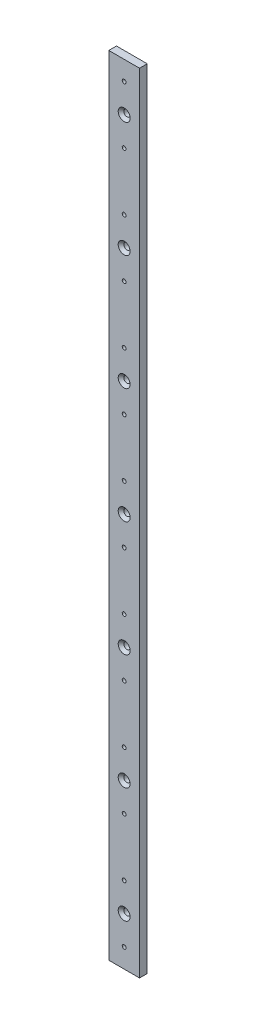
ISO-10303-21;
HEADER;
FILE_DESCRIPTION(('STEP AP214'),'2;1');
FILE_NAME('part.step','',(''),(''),'','','');
FILE_SCHEMA(('AUTOMOTIVE_DESIGN { 1 0 10303 214 1 1 1 1 }'));
ENDSEC;
DATA;
#1=APPLICATION_CONTEXT('core data for automotive mechanical design processes');
#2=APPLICATION_PROTOCOL_DEFINITION('international standard','automotive_design',2000,#1);
#3=PRODUCT_CONTEXT('',#1,'mechanical');
#4=PRODUCT('Part','Part','',(#3));
#5=PRODUCT_RELATED_PRODUCT_CATEGORY('part','',(#4));
#6=PRODUCT_DEFINITION_FORMATION('','',#4);
#7=PRODUCT_DEFINITION_CONTEXT('part definition',#1,'design');
#8=PRODUCT_DEFINITION('design','',#6,#7);
#9=PRODUCT_DEFINITION_SHAPE('','',#8);
#10=(LENGTH_UNIT() NAMED_UNIT(*) SI_UNIT(.MILLI.,.METRE.));
#11=(NAMED_UNIT(*) PLANE_ANGLE_UNIT() SI_UNIT($,.RADIAN.));
#12=(NAMED_UNIT(*) SI_UNIT($,.STERADIAN.) SOLID_ANGLE_UNIT());
#13=UNCERTAINTY_MEASURE_WITH_UNIT(LENGTH_MEASURE(1.E-05),#10,'distance_accuracy_value','');
#14=(GEOMETRIC_REPRESENTATION_CONTEXT(3) GLOBAL_UNCERTAINTY_ASSIGNED_CONTEXT((#13)) GLOBAL_UNIT_ASSIGNED_CONTEXT((#10,
#11,#12)) REPRESENTATION_CONTEXT('',''));
#15=CARTESIAN_POINT('',(0.,0.,0.));
#16=DIRECTION('',(0.,0.,1.));
#17=DIRECTION('',(1.,0.,0.));
#18=AXIS2_PLACEMENT_3D('',#15,#16,#17);
#19=CARTESIAN_POINT('',(16.,50.,8.00230000004376));
#20=DIRECTION('',(0.,0.,1.));
#21=DIRECTION('',(1.,0.,0.));
#22=AXIS2_PLACEMENT_3D('',#19,#20,#21);
#23=CONICAL_SURFACE('',#22,6.199999999998,0.785398163397448);
#24=CARTESIAN_POINT('',(16.,50.,5.1023));
#25=DIRECTION('',(0.,0.,1.));
#26=DIRECTION('',(1.,0.,0.));
#27=AXIS2_PLACEMENT_3D('',#24,#25,#26);
#28=CIRCLE('',#27,3.3);
#29=CARTESIAN_POINT('',(19.3,50.,5.1023));
#30=VERTEX_POINT('',#29);
#31=EDGE_CURVE('E186',#30,#30,#28,.F.);
#32=ORIENTED_EDGE('',*,*,#31,.T.);
#33=EDGE_LOOP('',(#32));
#34=FACE_BOUND('',#33,.T.);
#35=CARTESIAN_POINT('',(16.,50.,8.00230000002421));
#36=DIRECTION('',(0.,0.,1.));
#37=DIRECTION('',(1.,0.,0.));
#38=AXIS2_PLACEMENT_3D('',#35,#36,#37);
#39=CIRCLE('',#38,6.19999999997844);
#40=CARTESIAN_POINT('',(22.1999999999784,50.,8.00230000002421));
#41=VERTEX_POINT('',#40);
#42=EDGE_CURVE('E19',#41,#41,#39,.F.);
#43=ORIENTED_EDGE('',*,*,#42,.F.);
#44=EDGE_LOOP('',(#43));
#45=FACE_BOUND('',#44,.T.);
#46=ADVANCED_FACE('F16',(#34,#45),#23,.F.);
#47=CARTESIAN_POINT('',(16.,170.,8.00230000004376));
#48=DIRECTION('',(0.,0.,1.));
#49=DIRECTION('',(1.,0.,0.));
#50=AXIS2_PLACEMENT_3D('',#47,#48,#49);
#51=CONICAL_SURFACE('',#50,6.199999999998,0.785398163397448);
#52=CARTESIAN_POINT('',(16.,170.,5.1023));
#53=DIRECTION('',(0.,0.,1.));
#54=DIRECTION('',(1.,0.,0.));
#55=AXIS2_PLACEMENT_3D('',#52,#53,#54);
#56=CIRCLE('',#55,3.3);
#57=CARTESIAN_POINT('',(19.3,170.,5.1023));
#58=VERTEX_POINT('',#57);
#59=EDGE_CURVE('E179',#58,#58,#56,.F.);
#60=ORIENTED_EDGE('',*,*,#59,.T.);
#61=EDGE_LOOP('',(#60));
#62=FACE_BOUND('',#61,.T.);
#63=CARTESIAN_POINT('',(16.,170.,8.00230000002421));
#64=DIRECTION('',(0.,0.,1.));
#65=DIRECTION('',(1.,0.,0.));
#66=AXIS2_PLACEMENT_3D('',#63,#64,#65);
#67=CIRCLE('',#66,6.19999999997844);
#68=CARTESIAN_POINT('',(22.1999999999784,170.,8.00230000002421));
#69=VERTEX_POINT('',#68);
#70=EDGE_CURVE('E203',#69,#69,#67,.F.);
#71=ORIENTED_EDGE('',*,*,#70,.F.);
#72=EDGE_LOOP('',(#71));
#73=FACE_BOUND('',#72,.T.);
#74=ADVANCED_FACE('F213',(#62,#73),#51,.F.);
#75=CARTESIAN_POINT('',(16.,290.,8.00230000004376));
#76=DIRECTION('',(0.,0.,1.));
#77=DIRECTION('',(1.,0.,0.));
#78=AXIS2_PLACEMENT_3D('',#75,#76,#77);
#79=CONICAL_SURFACE('',#78,6.199999999998,0.785398163397448);
#80=CARTESIAN_POINT('',(16.,290.,5.1023));
#81=DIRECTION('',(0.,0.,1.));
#82=DIRECTION('',(1.,0.,0.));
#83=AXIS2_PLACEMENT_3D('',#80,#81,#82);
#84=CIRCLE('',#83,3.3);
#85=CARTESIAN_POINT('',(19.3,290.,5.1023));
#86=VERTEX_POINT('',#85);
#87=EDGE_CURVE('E172',#86,#86,#84,.F.);
#88=ORIENTED_EDGE('',*,*,#87,.T.);
#89=EDGE_LOOP('',(#88));
#90=FACE_BOUND('',#89,.T.);
#91=CARTESIAN_POINT('',(16.,290.,8.00230000002421));
#92=DIRECTION('',(0.,0.,1.));
#93=DIRECTION('',(1.,0.,0.));
#94=AXIS2_PLACEMENT_3D('',#91,#92,#93);
#95=CIRCLE('',#94,6.19999999997844);
#96=CARTESIAN_POINT('',(22.1999999999784,290.,8.00230000002421));
#97=VERTEX_POINT('',#96);
#98=EDGE_CURVE('E201',#97,#97,#95,.F.);
#99=ORIENTED_EDGE('',*,*,#98,.F.);
#100=EDGE_LOOP('',(#99));
#101=FACE_BOUND('',#100,.T.);
#102=ADVANCED_FACE('F219',(#90,#101),#79,.F.);
#103=CARTESIAN_POINT('',(16.,410.,8.00230000004376));
#104=DIRECTION('',(0.,0.,1.));
#105=DIRECTION('',(1.,0.,0.));
#106=AXIS2_PLACEMENT_3D('',#103,#104,#105);
#107=CONICAL_SURFACE('',#106,6.199999999998,0.785398163397448);
#108=CARTESIAN_POINT('',(16.,410.,5.1023));
#109=DIRECTION('',(0.,0.,1.));
#110=DIRECTION('',(1.,0.,0.));
#111=AXIS2_PLACEMENT_3D('',#108,#109,#110);
#112=CIRCLE('',#111,3.3);
#113=CARTESIAN_POINT('',(19.3,410.,5.1023));
#114=VERTEX_POINT('',#113);
#115=EDGE_CURVE('E165',#114,#114,#112,.F.);
#116=ORIENTED_EDGE('',*,*,#115,.T.);
#117=EDGE_LOOP('',(#116));
#118=FACE_BOUND('',#117,.T.);
#119=CARTESIAN_POINT('',(16.,410.,8.00230000002421));
#120=DIRECTION('',(0.,0.,1.));
#121=DIRECTION('',(1.,0.,0.));
#122=AXIS2_PLACEMENT_3D('',#119,#120,#121);
#123=CIRCLE('',#122,6.19999999997844);
#124=CARTESIAN_POINT('',(22.1999999999784,410.,8.00230000002421));
#125=VERTEX_POINT('',#124);
#126=EDGE_CURVE('E198',#125,#125,#123,.F.);
#127=ORIENTED_EDGE('',*,*,#126,.F.);
#128=EDGE_LOOP('',(#127));
#129=FACE_BOUND('',#128,.T.);
#130=ADVANCED_FACE('F340',(#118,#129),#107,.F.);
#131=CARTESIAN_POINT('',(16.,530.,8.00230000004376));
#132=DIRECTION('',(0.,0.,1.));
#133=DIRECTION('',(1.,0.,0.));
#134=AXIS2_PLACEMENT_3D('',#131,#132,#133);
#135=CONICAL_SURFACE('',#134,6.199999999998,0.785398163397448);
#136=CARTESIAN_POINT('',(16.,530.,5.1023));
#137=DIRECTION('',(0.,0.,1.));
#138=DIRECTION('',(1.,0.,0.));
#139=AXIS2_PLACEMENT_3D('',#136,#137,#138);
#140=CIRCLE('',#139,3.3);
#141=CARTESIAN_POINT('',(19.3,530.,5.1023));
#142=VERTEX_POINT('',#141);
#143=EDGE_CURVE('E158',#142,#142,#140,.F.);
#144=ORIENTED_EDGE('',*,*,#143,.T.);
#145=EDGE_LOOP('',(#144));
#146=FACE_BOUND('',#145,.T.);
#147=CARTESIAN_POINT('',(16.,530.,8.00230000002421));
#148=DIRECTION('',(0.,0.,1.));
#149=DIRECTION('',(1.,0.,0.));
#150=AXIS2_PLACEMENT_3D('',#147,#148,#149);
#151=CIRCLE('',#150,6.19999999997844);
#152=CARTESIAN_POINT('',(22.1999999999784,530.,8.00230000002421));
#153=VERTEX_POINT('',#152);
#154=EDGE_CURVE('E195',#153,#153,#151,.F.);
#155=ORIENTED_EDGE('',*,*,#154,.F.);
#156=EDGE_LOOP('',(#155));
#157=FACE_BOUND('',#156,.T.);
#158=ADVANCED_FACE('F336',(#146,#157),#135,.F.);
#159=CARTESIAN_POINT('',(16.,650.,8.00230000004376));
#160=DIRECTION('',(0.,0.,1.));
#161=DIRECTION('',(1.,0.,0.));
#162=AXIS2_PLACEMENT_3D('',#159,#160,#161);
#163=CONICAL_SURFACE('',#162,6.199999999998,0.785398163397448);
#164=CARTESIAN_POINT('',(16.,650.,5.1023));
#165=DIRECTION('',(0.,0.,1.));
#166=DIRECTION('',(1.,0.,0.));
#167=AXIS2_PLACEMENT_3D('',#164,#165,#166);
#168=CIRCLE('',#167,3.3);
#169=CARTESIAN_POINT('',(19.3,650.,5.1023));
#170=VERTEX_POINT('',#169);
#171=EDGE_CURVE('E151',#170,#170,#168,.F.);
#172=ORIENTED_EDGE('',*,*,#171,.T.);
#173=EDGE_LOOP('',(#172));
#174=FACE_BOUND('',#173,.T.);
#175=CARTESIAN_POINT('',(16.,650.,8.00230000002421));
#176=DIRECTION('',(0.,0.,1.));
#177=DIRECTION('',(1.,0.,0.));
#178=AXIS2_PLACEMENT_3D('',#175,#176,#177);
#179=CIRCLE('',#178,6.19999999997844);
#180=CARTESIAN_POINT('',(22.1999999999784,650.,8.00230000002421));
#181=VERTEX_POINT('',#180);
#182=EDGE_CURVE('E192',#181,#181,#179,.F.);
#183=ORIENTED_EDGE('',*,*,#182,.F.);
#184=EDGE_LOOP('',(#183));
#185=FACE_BOUND('',#184,.T.);
#186=ADVANCED_FACE('F332',(#174,#185),#163,.F.);
#187=CARTESIAN_POINT('',(16.,770.,8.00230000004376));
#188=DIRECTION('',(0.,0.,1.));
#189=DIRECTION('',(1.,0.,0.));
#190=AXIS2_PLACEMENT_3D('',#187,#188,#189);
#191=CONICAL_SURFACE('',#190,6.199999999998,0.785398163397448);
#192=CARTESIAN_POINT('',(16.,770.,5.1023));
#193=DIRECTION('',(0.,0.,1.));
#194=DIRECTION('',(1.,0.,0.));
#195=AXIS2_PLACEMENT_3D('',#192,#193,#194);
#196=CIRCLE('',#195,3.3);
#197=CARTESIAN_POINT('',(19.3,770.,5.1023));
#198=VERTEX_POINT('',#197);
#199=EDGE_CURVE('E144',#198,#198,#196,.F.);
#200=ORIENTED_EDGE('',*,*,#199,.T.);
#201=EDGE_LOOP('',(#200));
#202=FACE_BOUND('',#201,.T.);
#203=CARTESIAN_POINT('',(16.,770.,8.00230000002421));
#204=DIRECTION('',(0.,0.,1.));
#205=DIRECTION('',(1.,0.,0.));
#206=AXIS2_PLACEMENT_3D('',#203,#204,#205);
#207=CIRCLE('',#206,6.19999999997844);
#208=CARTESIAN_POINT('',(22.1999999999784,770.,8.00230000002421));
#209=VERTEX_POINT('',#208);
#210=EDGE_CURVE('E66',#209,#209,#207,.F.);
#211=ORIENTED_EDGE('',*,*,#210,.F.);
#212=EDGE_LOOP('',(#211));
#213=FACE_BOUND('',#212,.T.);
#214=ADVANCED_FACE('F328',(#202,#213),#191,.F.);
#215=CARTESIAN_POINT('',(0.,0.,8.0023));
#216=DIRECTION('',(0.,0.,1.));
#217=DIRECTION('',(1.,0.,0.));
#218=AXIS2_PLACEMENT_3D('',#215,#216,#217);
#219=PLANE('',#218);
#220=CARTESIAN_POINT('',(16.,800.,8.0023));
#221=DIRECTION('',(0.,0.,1.));
#222=DIRECTION('',(1.,0.,0.));
#223=AXIS2_PLACEMENT_3D('',#220,#221,#222);
#224=CIRCLE('',#223,2.);
#225=CARTESIAN_POINT('',(18.,800.,8.0023));
#226=VERTEX_POINT('',#225);
#227=EDGE_CURVE('E141',#226,#226,#224,.F.);
#228=ORIENTED_EDGE('',*,*,#227,.T.);
#229=EDGE_LOOP('',(#228));
#230=FACE_BOUND('',#229,.T.);
#231=ORIENTED_EDGE('',*,*,#210,.T.);
#232=EDGE_LOOP('',(#231));
#233=FACE_BOUND('',#232,.T.);
#234=CARTESIAN_POINT('',(16.,740.,8.0023));
#235=DIRECTION('',(0.,0.,1.));
#236=DIRECTION('',(1.,0.,0.));
#237=AXIS2_PLACEMENT_3D('',#234,#235,#236);
#238=CIRCLE('',#237,2.);
#239=CARTESIAN_POINT('',(18.,740.,8.0023));
#240=VERTEX_POINT('',#239);
#241=EDGE_CURVE('E145',#240,#240,#238,.F.);
#242=ORIENTED_EDGE('',*,*,#241,.T.);
#243=EDGE_LOOP('',(#242));
#244=FACE_BOUND('',#243,.T.);
#245=CARTESIAN_POINT('',(16.,680.,8.0023));
#246=DIRECTION('',(0.,0.,1.));
#247=DIRECTION('',(1.,0.,0.));
#248=AXIS2_PLACEMENT_3D('',#245,#246,#247);
#249=CIRCLE('',#248,2.);
#250=CARTESIAN_POINT('',(18.,680.,8.0023));
#251=VERTEX_POINT('',#250);
#252=EDGE_CURVE('E148',#251,#251,#249,.F.);
#253=ORIENTED_EDGE('',*,*,#252,.T.);
#254=EDGE_LOOP('',(#253));
#255=FACE_BOUND('',#254,.T.);
#256=ORIENTED_EDGE('',*,*,#182,.T.);
#257=EDGE_LOOP('',(#256));
#258=FACE_BOUND('',#257,.T.);
#259=CARTESIAN_POINT('',(16.,620.,8.0023));
#260=DIRECTION('',(0.,0.,1.));
#261=DIRECTION('',(1.,0.,0.));
#262=AXIS2_PLACEMENT_3D('',#259,#260,#261);
#263=CIRCLE('',#262,2.);
#264=CARTESIAN_POINT('',(18.,620.,8.0023));
#265=VERTEX_POINT('',#264);
#266=EDGE_CURVE('E152',#265,#265,#263,.F.);
#267=ORIENTED_EDGE('',*,*,#266,.T.);
#268=EDGE_LOOP('',(#267));
#269=FACE_BOUND('',#268,.T.);
#270=CARTESIAN_POINT('',(16.,560.,8.0023));
#271=DIRECTION('',(0.,0.,1.));
#272=DIRECTION('',(1.,0.,0.));
#273=AXIS2_PLACEMENT_3D('',#270,#271,#272);
#274=CIRCLE('',#273,2.);
#275=CARTESIAN_POINT('',(18.,560.,8.0023));
#276=VERTEX_POINT('',#275);
#277=EDGE_CURVE('E155',#276,#276,#274,.F.);
#278=ORIENTED_EDGE('',*,*,#277,.T.);
#279=EDGE_LOOP('',(#278));
#280=FACE_BOUND('',#279,.T.);
#281=ORIENTED_EDGE('',*,*,#154,.T.);
#282=EDGE_LOOP('',(#281));
#283=FACE_BOUND('',#282,.T.);
#284=CARTESIAN_POINT('',(16.,500.,8.0023));
#285=DIRECTION('',(0.,0.,1.));
#286=DIRECTION('',(1.,0.,0.));
#287=AXIS2_PLACEMENT_3D('',#284,#285,#286);
#288=CIRCLE('',#287,2.);
#289=CARTESIAN_POINT('',(18.,500.,8.0023));
#290=VERTEX_POINT('',#289);
#291=EDGE_CURVE('E159',#290,#290,#288,.F.);
#292=ORIENTED_EDGE('',*,*,#291,.T.);
#293=EDGE_LOOP('',(#292));
#294=FACE_BOUND('',#293,.T.);
#295=CARTESIAN_POINT('',(16.,440.,8.0023));
#296=DIRECTION('',(0.,0.,1.));
#297=DIRECTION('',(1.,0.,0.));
#298=AXIS2_PLACEMENT_3D('',#295,#296,#297);
#299=CIRCLE('',#298,2.);
#300=CARTESIAN_POINT('',(18.,440.,8.0023));
#301=VERTEX_POINT('',#300);
#302=EDGE_CURVE('E162',#301,#301,#299,.F.);
#303=ORIENTED_EDGE('',*,*,#302,.T.);
#304=EDGE_LOOP('',(#303));
#305=FACE_BOUND('',#304,.T.);
#306=ORIENTED_EDGE('',*,*,#126,.T.);
#307=EDGE_LOOP('',(#306));
#308=FACE_BOUND('',#307,.T.);
#309=CARTESIAN_POINT('',(16.,380.,8.0023));
#310=DIRECTION('',(0.,0.,1.));
#311=DIRECTION('',(1.,0.,0.));
#312=AXIS2_PLACEMENT_3D('',#309,#310,#311);
#313=CIRCLE('',#312,2.);
#314=CARTESIAN_POINT('',(18.,380.,8.0023));
#315=VERTEX_POINT('',#314);
#316=EDGE_CURVE('E166',#315,#315,#313,.F.);
#317=ORIENTED_EDGE('',*,*,#316,.T.);
#318=EDGE_LOOP('',(#317));
#319=FACE_BOUND('',#318,.T.);
#320=CARTESIAN_POINT('',(16.,320.,8.0023));
#321=DIRECTION('',(0.,0.,1.));
#322=DIRECTION('',(1.,0.,0.));
#323=AXIS2_PLACEMENT_3D('',#320,#321,#322);
#324=CIRCLE('',#323,2.);
#325=CARTESIAN_POINT('',(18.,320.,8.0023));
#326=VERTEX_POINT('',#325);
#327=EDGE_CURVE('E169',#326,#326,#324,.F.);
#328=ORIENTED_EDGE('',*,*,#327,.T.);
#329=EDGE_LOOP('',(#328));
#330=FACE_BOUND('',#329,.T.);
#331=ORIENTED_EDGE('',*,*,#98,.T.);
#332=EDGE_LOOP('',(#331));
#333=FACE_BOUND('',#332,.T.);
#334=CARTESIAN_POINT('',(16.,260.,8.0023));
#335=DIRECTION('',(0.,0.,1.));
#336=DIRECTION('',(1.,0.,0.));
#337=AXIS2_PLACEMENT_3D('',#334,#335,#336);
#338=CIRCLE('',#337,2.);
#339=CARTESIAN_POINT('',(18.,260.,8.0023));
#340=VERTEX_POINT('',#339);
#341=EDGE_CURVE('E173',#340,#340,#338,.F.);
#342=ORIENTED_EDGE('',*,*,#341,.T.);
#343=EDGE_LOOP('',(#342));
#344=FACE_BOUND('',#343,.T.);
#345=CARTESIAN_POINT('',(16.,200.,8.0023));
#346=DIRECTION('',(0.,0.,1.));
#347=DIRECTION('',(1.,0.,0.));
#348=AXIS2_PLACEMENT_3D('',#345,#346,#347);
#349=CIRCLE('',#348,2.);
#350=CARTESIAN_POINT('',(18.,200.,8.0023));
#351=VERTEX_POINT('',#350);
#352=EDGE_CURVE('E176',#351,#351,#349,.F.);
#353=ORIENTED_EDGE('',*,*,#352,.T.);
#354=EDGE_LOOP('',(#353));
#355=FACE_BOUND('',#354,.T.);
#356=ORIENTED_EDGE('',*,*,#70,.T.);
#357=EDGE_LOOP('',(#356));
#358=FACE_BOUND('',#357,.T.);
#359=CARTESIAN_POINT('',(16.,140.,8.0023));
#360=DIRECTION('',(0.,0.,1.));
#361=DIRECTION('',(1.,0.,0.));
#362=AXIS2_PLACEMENT_3D('',#359,#360,#361);
#363=CIRCLE('',#362,2.);
#364=CARTESIAN_POINT('',(18.,140.,8.0023));
#365=VERTEX_POINT('',#364);
#366=EDGE_CURVE('E180',#365,#365,#363,.F.);
#367=ORIENTED_EDGE('',*,*,#366,.T.);
#368=EDGE_LOOP('',(#367));
#369=FACE_BOUND('',#368,.T.);
#370=CARTESIAN_POINT('',(16.,80.,8.0023));
#371=DIRECTION('',(0.,0.,1.));
#372=DIRECTION('',(1.,0.,0.));
#373=AXIS2_PLACEMENT_3D('',#370,#371,#372);
#374=CIRCLE('',#373,2.);
#375=CARTESIAN_POINT('',(18.,80.,8.0023));
#376=VERTEX_POINT('',#375);
#377=EDGE_CURVE('E183',#376,#376,#374,.F.);
#378=ORIENTED_EDGE('',*,*,#377,.T.);
#379=EDGE_LOOP('',(#378));
#380=FACE_BOUND('',#379,.T.);
#381=ORIENTED_EDGE('',*,*,#42,.T.);
#382=EDGE_LOOP('',(#381));
#383=FACE_BOUND('',#382,.T.);
#384=CARTESIAN_POINT('',(16.,20.,8.0023));
#385=DIRECTION('',(0.,0.,1.));
#386=DIRECTION('',(1.,0.,0.));
#387=AXIS2_PLACEMENT_3D('',#384,#385,#386);
#388=CIRCLE('',#387,2.);
#389=CARTESIAN_POINT('',(18.,20.,8.0023));
#390=VERTEX_POINT('',#389);
#391=EDGE_CURVE('E187',#390,#390,#388,.F.);
#392=ORIENTED_EDGE('',*,*,#391,.T.);
#393=EDGE_LOOP('',(#392));
#394=FACE_BOUND('',#393,.T.);
#395=DIRECTION('',(0.,1.,0.));
#396=VECTOR('',#395,1.);
#397=CARTESIAN_POINT('',(32.,0.,8.0023));
#398=LINE('',#397,#396);
#399=CARTESIAN_POINT('',(32.,820.,8.0023));
#400=VERTEX_POINT('',#399);
#401=CARTESIAN_POINT('',(32.,0.,8.0023));
#402=VERTEX_POINT('',#401);
#403=EDGE_CURVE('E378',#400,#402,#398,.F.);
#404=ORIENTED_EDGE('',*,*,#403,.F.);
#405=DIRECTION('',(1.,0.,0.));
#406=VECTOR('',#405,1.);
#407=CARTESIAN_POINT('',(0.,820.,8.0023));
#408=LINE('',#407,#406);
#409=CARTESIAN_POINT('',(0.,820.,8.0023));
#410=VERTEX_POINT('',#409);
#411=EDGE_CURVE('E60',#410,#400,#408,.T.);
#412=ORIENTED_EDGE('',*,*,#411,.F.);
#413=DIRECTION('',(0.,1.,0.));
#414=VECTOR('',#413,1.);
#415=CARTESIAN_POINT('',(0.,0.,8.0023));
#416=LINE('',#415,#414);
#417=CARTESIAN_POINT('',(0.,0.,8.0023));
#418=VERTEX_POINT('',#417);
#419=EDGE_CURVE('E58',#410,#418,#416,.F.);
#420=ORIENTED_EDGE('',*,*,#419,.T.);
#421=DIRECTION('',(1.,0.,0.));
#422=VECTOR('',#421,1.);
#423=CARTESIAN_POINT('',(0.,0.,8.0023));
#424=LINE('',#423,#422);
#425=EDGE_CURVE('E55',#418,#402,#424,.T.);
#426=ORIENTED_EDGE('',*,*,#425,.T.);
#427=EDGE_LOOP('',(#404,#412,#420,#426));
#428=FACE_BOUND('',#427,.T.);
#429=ADVANCED_FACE('F59',(#230,#233,#244,#255,#258,#269,#280,#283,#294,#305,#308,#319,#330,#333,
#344,#355,#358,#369,#380,#383,#394,#428),#219,.T.);
#430=CARTESIAN_POINT('',(0.,0.,0.002300000000105));
#431=DIRECTION('',(1.,0.,0.));
#432=DIRECTION('',(0.,0.,-1.));
#433=AXIS2_PLACEMENT_3D('',#430,#431,#432);
#434=PLANE('',#433);
#435=DIRECTION('',(0.,0.,1.));
#436=VECTOR('',#435,1.);
#437=CARTESIAN_POINT('',(0.,820.,0.002300000000105));
#438=LINE('',#437,#436);
#439=CARTESIAN_POINT('',(0.,820.,0.0023000000000195));
#440=VERTEX_POINT('',#439);
#441=EDGE_CURVE('E376',#440,#410,#438,.T.);
#442=ORIENTED_EDGE('',*,*,#441,.F.);
#443=DIRECTION('',(0.,1.,0.));
#444=VECTOR('',#443,1.);
#445=CARTESIAN_POINT('',(0.,0.,0.002300000000105));
#446=LINE('',#445,#444);
#447=CARTESIAN_POINT('',(0.,0.,0.0023000000000195));
#448=VERTEX_POINT('',#447);
#449=EDGE_CURVE('E77',#440,#448,#446,.F.);
#450=ORIENTED_EDGE('',*,*,#449,.T.);
#451=DIRECTION('',(0.,0.,1.));
#452=VECTOR('',#451,1.);
#453=CARTESIAN_POINT('',(0.,0.,0.002300000000105));
#454=LINE('',#453,#452);
#455=EDGE_CURVE('E65',#448,#418,#454,.T.);
#456=ORIENTED_EDGE('',*,*,#455,.T.);
#457=ORIENTED_EDGE('',*,*,#419,.F.);
#458=EDGE_LOOP('',(#442,#450,#456,#457));
#459=FACE_BOUND('',#458,.T.);
#460=ADVANCED_FACE('F76',(#459),#434,.F.);
#461=CARTESIAN_POINT('',(0.,0.,0.002300000000105));
#462=DIRECTION('',(0.,1.,0.));
#463=DIRECTION('',(0.,0.,1.));
#464=AXIS2_PLACEMENT_3D('',#461,#462,#463);
#465=PLANE('',#464);
#466=ORIENTED_EDGE('',*,*,#425,.F.);
#467=ORIENTED_EDGE('',*,*,#455,.F.);
#468=DIRECTION('',(1.,0.,0.));
#469=VECTOR('',#468,1.);
#470=CARTESIAN_POINT('',(0.,0.,0.002300000000105));
#471=LINE('',#470,#469);
#472=CARTESIAN_POINT('',(32.,0.,0.0023000000000195));
#473=VERTEX_POINT('',#472);
#474=EDGE_CURVE('E383',#448,#473,#471,.T.);
#475=ORIENTED_EDGE('',*,*,#474,.T.);
#476=DIRECTION('',(0.,0.,-1.));
#477=VECTOR('',#476,1.);
#478=CARTESIAN_POINT('',(32.,0.,0.002300000000105));
#479=LINE('',#478,#477);
#480=EDGE_CURVE('E73',#402,#473,#479,.T.);
#481=ORIENTED_EDGE('',*,*,#480,.F.);
#482=EDGE_LOOP('',(#466,#467,#475,#481));
#483=FACE_BOUND('',#482,.T.);
#484=ADVANCED_FACE('F70',(#483),#465,.F.);
#485=CARTESIAN_POINT('',(32.,0.,0.002300000000105));
#486=DIRECTION('',(1.,0.,0.));
#487=DIRECTION('',(0.,0.,-1.));
#488=AXIS2_PLACEMENT_3D('',#485,#486,#487);
#489=PLANE('',#488);
#490=DIRECTION('',(0.,0.,1.));
#491=VECTOR('',#490,1.);
#492=CARTESIAN_POINT('',(32.,820.,0.002300000000105));
#493=LINE('',#492,#491);
#494=CARTESIAN_POINT('',(32.,820.,0.0023000000000195));
#495=VERTEX_POINT('',#494);
#496=EDGE_CURVE('E34',#400,#495,#493,.F.);
#497=ORIENTED_EDGE('',*,*,#496,.F.);
#498=ORIENTED_EDGE('',*,*,#403,.T.);
#499=ORIENTED_EDGE('',*,*,#480,.T.);
#500=DIRECTION('',(0.,1.,0.));
#501=VECTOR('',#500,1.);
#502=CARTESIAN_POINT('',(32.,0.,0.002300000000105));
#503=LINE('',#502,#501);
#504=EDGE_CURVE('E381',#473,#495,#503,.T.);
#505=ORIENTED_EDGE('',*,*,#504,.T.);
#506=EDGE_LOOP('',(#497,#498,#499,#505));
#507=FACE_BOUND('',#506,.T.);
#508=ADVANCED_FACE('F318',(#507),#489,.T.);
#509=CARTESIAN_POINT('',(0.,820.,0.002300000000105));
#510=DIRECTION('',(0.,1.,0.));
#511=DIRECTION('',(0.,0.,1.));
#512=AXIS2_PLACEMENT_3D('',#509,#510,#511);
#513=PLANE('',#512);
#514=ORIENTED_EDGE('',*,*,#411,.T.);
#515=ORIENTED_EDGE('',*,*,#496,.T.);
#516=DIRECTION('',(1.,0.,0.));
#517=VECTOR('',#516,1.);
#518=CARTESIAN_POINT('',(0.,820.,0.002300000000105));
#519=LINE('',#518,#517);
#520=EDGE_CURVE('E140',#495,#440,#519,.F.);
#521=ORIENTED_EDGE('',*,*,#520,.T.);
#522=ORIENTED_EDGE('',*,*,#441,.T.);
#523=EDGE_LOOP('',(#514,#515,#521,#522));
#524=FACE_BOUND('',#523,.T.);
#525=ADVANCED_FACE('F314',(#524),#513,.T.);
#526=CARTESIAN_POINT('',(16.,20.,0.002300000000105));
#527=DIRECTION('',(0.,0.,1.));
#528=DIRECTION('',(1.,0.,0.));
#529=AXIS2_PLACEMENT_3D('',#526,#527,#528);
#530=CYLINDRICAL_SURFACE('',#529,2.);
#531=CARTESIAN_POINT('',(16.,20.,0.002299999999991));
#532=DIRECTION('',(0.,0.,1.));
#533=DIRECTION('',(1.,0.,0.));
#534=AXIS2_PLACEMENT_3D('',#531,#532,#533);
#535=CIRCLE('',#534,2.);
#536=CARTESIAN_POINT('',(18.,20.,0.002299999999991));
#537=VERTEX_POINT('',#536);
#538=EDGE_CURVE('E137',#537,#537,#535,.F.);
#539=ORIENTED_EDGE('',*,*,#538,.T.);
#540=EDGE_LOOP('',(#539));
#541=FACE_BOUND('',#540,.T.);
#542=ORIENTED_EDGE('',*,*,#391,.F.);
#543=EDGE_LOOP('',(#542));
#544=FACE_BOUND('',#543,.T.);
#545=ADVANCED_FACE('F310',(#541,#544),#530,.F.);
#546=CARTESIAN_POINT('',(16.,50.,0.002300000000105));
#547=DIRECTION('',(0.,0.,1.));
#548=DIRECTION('',(1.,0.,0.));
#549=AXIS2_PLACEMENT_3D('',#546,#547,#548);
#550=CYLINDRICAL_SURFACE('',#549,3.3);
#551=CARTESIAN_POINT('',(16.,50.,0.002299999999991));
#552=DIRECTION('',(0.,0.,1.));
#553=DIRECTION('',(1.,0.,0.));
#554=AXIS2_PLACEMENT_3D('',#551,#552,#553);
#555=CIRCLE('',#554,3.3);
#556=CARTESIAN_POINT('',(19.3,50.,0.002299999999991));
#557=VERTEX_POINT('',#556);
#558=EDGE_CURVE('E134',#557,#557,#555,.F.);
#559=ORIENTED_EDGE('',*,*,#558,.T.);
#560=EDGE_LOOP('',(#559));
#561=FACE_BOUND('',#560,.T.);
#562=ORIENTED_EDGE('',*,*,#31,.F.);
#563=EDGE_LOOP('',(#562));
#564=FACE_BOUND('',#563,.T.);
#565=ADVANCED_FACE('F306',(#561,#564),#550,.F.);
#566=CARTESIAN_POINT('',(16.,80.,0.002300000000105));
#567=DIRECTION('',(0.,0.,1.));
#568=DIRECTION('',(1.,0.,0.));
#569=AXIS2_PLACEMENT_3D('',#566,#567,#568);
#570=CYLINDRICAL_SURFACE('',#569,2.);
#571=CARTESIAN_POINT('',(16.,80.,0.002299999999991));
#572=DIRECTION('',(0.,0.,1.));
#573=DIRECTION('',(1.,0.,0.));
#574=AXIS2_PLACEMENT_3D('',#571,#572,#573);
#575=CIRCLE('',#574,2.);
#576=CARTESIAN_POINT('',(18.,80.,0.002299999999991));
#577=VERTEX_POINT('',#576);
#578=EDGE_CURVE('E131',#577,#577,#575,.F.);
#579=ORIENTED_EDGE('',*,*,#578,.T.);
#580=EDGE_LOOP('',(#579));
#581=FACE_BOUND('',#580,.T.);
#582=ORIENTED_EDGE('',*,*,#377,.F.);
#583=EDGE_LOOP('',(#582));
#584=FACE_BOUND('',#583,.T.);
#585=ADVANCED_FACE('F302',(#581,#584),#570,.F.);
#586=CARTESIAN_POINT('',(16.,140.,0.002300000000105));
#587=DIRECTION('',(0.,0.,1.));
#588=DIRECTION('',(1.,0.,0.));
#589=AXIS2_PLACEMENT_3D('',#586,#587,#588);
#590=CYLINDRICAL_SURFACE('',#589,2.);
#591=CARTESIAN_POINT('',(16.,140.,0.002299999999991));
#592=DIRECTION('',(0.,0.,1.));
#593=DIRECTION('',(1.,0.,0.));
#594=AXIS2_PLACEMENT_3D('',#591,#592,#593);
#595=CIRCLE('',#594,2.);
#596=CARTESIAN_POINT('',(18.,140.,0.002299999999991));
#597=VERTEX_POINT('',#596);
#598=EDGE_CURVE('E128',#597,#597,#595,.F.);
#599=ORIENTED_EDGE('',*,*,#598,.T.);
#600=EDGE_LOOP('',(#599));
#601=FACE_BOUND('',#600,.T.);
#602=ORIENTED_EDGE('',*,*,#366,.F.);
#603=EDGE_LOOP('',(#602));
#604=FACE_BOUND('',#603,.T.);
#605=ADVANCED_FACE('F298',(#601,#604),#590,.F.);
#606=CARTESIAN_POINT('',(16.,170.,0.002300000000105));
#607=DIRECTION('',(0.,0.,1.));
#608=DIRECTION('',(1.,0.,0.));
#609=AXIS2_PLACEMENT_3D('',#606,#607,#608);
#610=CYLINDRICAL_SURFACE('',#609,3.3);
#611=CARTESIAN_POINT('',(16.,170.,0.002299999999991));
#612=DIRECTION('',(0.,0.,1.));
#613=DIRECTION('',(1.,0.,0.));
#614=AXIS2_PLACEMENT_3D('',#611,#612,#613);
#615=CIRCLE('',#614,3.3);
#616=CARTESIAN_POINT('',(19.3,170.,0.002299999999991));
#617=VERTEX_POINT('',#616);
#618=EDGE_CURVE('E125',#617,#617,#615,.F.);
#619=ORIENTED_EDGE('',*,*,#618,.T.);
#620=EDGE_LOOP('',(#619));
#621=FACE_BOUND('',#620,.T.);
#622=ORIENTED_EDGE('',*,*,#59,.F.);
#623=EDGE_LOOP('',(#622));
#624=FACE_BOUND('',#623,.T.);
#625=ADVANCED_FACE('F294',(#621,#624),#610,.F.);
#626=CARTESIAN_POINT('',(16.,200.,0.002300000000105));
#627=DIRECTION('',(0.,0.,1.));
#628=DIRECTION('',(1.,0.,0.));
#629=AXIS2_PLACEMENT_3D('',#626,#627,#628);
#630=CYLINDRICAL_SURFACE('',#629,2.);
#631=CARTESIAN_POINT('',(16.,200.,0.002299999999991));
#632=DIRECTION('',(0.,0.,1.));
#633=DIRECTION('',(1.,0.,0.));
#634=AXIS2_PLACEMENT_3D('',#631,#632,#633);
#635=CIRCLE('',#634,2.);
#636=CARTESIAN_POINT('',(18.,200.,0.002299999999991));
#637=VERTEX_POINT('',#636);
#638=EDGE_CURVE('E122',#637,#637,#635,.F.);
#639=ORIENTED_EDGE('',*,*,#638,.T.);
#640=EDGE_LOOP('',(#639));
#641=FACE_BOUND('',#640,.T.);
#642=ORIENTED_EDGE('',*,*,#352,.F.);
#643=EDGE_LOOP('',(#642));
#644=FACE_BOUND('',#643,.T.);
#645=ADVANCED_FACE('F290',(#641,#644),#630,.F.);
#646=CARTESIAN_POINT('',(16.,260.,0.002300000000105));
#647=DIRECTION('',(0.,0.,1.));
#648=DIRECTION('',(1.,0.,0.));
#649=AXIS2_PLACEMENT_3D('',#646,#647,#648);
#650=CYLINDRICAL_SURFACE('',#649,2.);
#651=CARTESIAN_POINT('',(16.,260.,0.002299999999991));
#652=DIRECTION('',(0.,0.,1.));
#653=DIRECTION('',(1.,0.,0.));
#654=AXIS2_PLACEMENT_3D('',#651,#652,#653);
#655=CIRCLE('',#654,2.);
#656=CARTESIAN_POINT('',(18.,260.,0.002299999999991));
#657=VERTEX_POINT('',#656);
#658=EDGE_CURVE('E119',#657,#657,#655,.F.);
#659=ORIENTED_EDGE('',*,*,#658,.T.);
#660=EDGE_LOOP('',(#659));
#661=FACE_BOUND('',#660,.T.);
#662=ORIENTED_EDGE('',*,*,#341,.F.);
#663=EDGE_LOOP('',(#662));
#664=FACE_BOUND('',#663,.T.);
#665=ADVANCED_FACE('F286',(#661,#664),#650,.F.);
#666=CARTESIAN_POINT('',(16.,290.,0.002300000000105));
#667=DIRECTION('',(0.,0.,1.));
#668=DIRECTION('',(1.,0.,0.));
#669=AXIS2_PLACEMENT_3D('',#666,#667,#668);
#670=CYLINDRICAL_SURFACE('',#669,3.3);
#671=CARTESIAN_POINT('',(16.,290.,0.002299999999991));
#672=DIRECTION('',(0.,0.,1.));
#673=DIRECTION('',(1.,0.,0.));
#674=AXIS2_PLACEMENT_3D('',#671,#672,#673);
#675=CIRCLE('',#674,3.3);
#676=CARTESIAN_POINT('',(19.3,290.,0.002299999999991));
#677=VERTEX_POINT('',#676);
#678=EDGE_CURVE('E116',#677,#677,#675,.F.);
#679=ORIENTED_EDGE('',*,*,#678,.T.);
#680=EDGE_LOOP('',(#679));
#681=FACE_BOUND('',#680,.T.);
#682=ORIENTED_EDGE('',*,*,#87,.F.);
#683=EDGE_LOOP('',(#682));
#684=FACE_BOUND('',#683,.T.);
#685=ADVANCED_FACE('F282',(#681,#684),#670,.F.);
#686=CARTESIAN_POINT('',(16.,320.,0.002300000000105));
#687=DIRECTION('',(0.,0.,1.));
#688=DIRECTION('',(1.,0.,0.));
#689=AXIS2_PLACEMENT_3D('',#686,#687,#688);
#690=CYLINDRICAL_SURFACE('',#689,2.);
#691=CARTESIAN_POINT('',(16.,320.,0.002299999999991));
#692=DIRECTION('',(0.,0.,1.));
#693=DIRECTION('',(1.,0.,0.));
#694=AXIS2_PLACEMENT_3D('',#691,#692,#693);
#695=CIRCLE('',#694,2.);
#696=CARTESIAN_POINT('',(18.,320.,0.002299999999991));
#697=VERTEX_POINT('',#696);
#698=EDGE_CURVE('E113',#697,#697,#695,.F.);
#699=ORIENTED_EDGE('',*,*,#698,.T.);
#700=EDGE_LOOP('',(#699));
#701=FACE_BOUND('',#700,.T.);
#702=ORIENTED_EDGE('',*,*,#327,.F.);
#703=EDGE_LOOP('',(#702));
#704=FACE_BOUND('',#703,.T.);
#705=ADVANCED_FACE('F278',(#701,#704),#690,.F.);
#706=CARTESIAN_POINT('',(16.,380.,0.002300000000105));
#707=DIRECTION('',(0.,0.,1.));
#708=DIRECTION('',(1.,0.,0.));
#709=AXIS2_PLACEMENT_3D('',#706,#707,#708);
#710=CYLINDRICAL_SURFACE('',#709,2.);
#711=CARTESIAN_POINT('',(16.,380.,0.002299999999991));
#712=DIRECTION('',(0.,0.,1.));
#713=DIRECTION('',(1.,0.,0.));
#714=AXIS2_PLACEMENT_3D('',#711,#712,#713);
#715=CIRCLE('',#714,2.);
#716=CARTESIAN_POINT('',(18.,380.,0.002299999999991));
#717=VERTEX_POINT('',#716);
#718=EDGE_CURVE('E110',#717,#717,#715,.F.);
#719=ORIENTED_EDGE('',*,*,#718,.T.);
#720=EDGE_LOOP('',(#719));
#721=FACE_BOUND('',#720,.T.);
#722=ORIENTED_EDGE('',*,*,#316,.F.);
#723=EDGE_LOOP('',(#722));
#724=FACE_BOUND('',#723,.T.);
#725=ADVANCED_FACE('F274',(#721,#724),#710,.F.);
#726=CARTESIAN_POINT('',(16.,410.,0.002300000000105));
#727=DIRECTION('',(0.,0.,1.));
#728=DIRECTION('',(1.,0.,0.));
#729=AXIS2_PLACEMENT_3D('',#726,#727,#728);
#730=CYLINDRICAL_SURFACE('',#729,3.3);
#731=CARTESIAN_POINT('',(16.,410.,0.002299999999991));
#732=DIRECTION('',(0.,0.,1.));
#733=DIRECTION('',(1.,0.,0.));
#734=AXIS2_PLACEMENT_3D('',#731,#732,#733);
#735=CIRCLE('',#734,3.3);
#736=CARTESIAN_POINT('',(19.3,410.,0.002299999999991));
#737=VERTEX_POINT('',#736);
#738=EDGE_CURVE('E107',#737,#737,#735,.F.);
#739=ORIENTED_EDGE('',*,*,#738,.T.);
#740=EDGE_LOOP('',(#739));
#741=FACE_BOUND('',#740,.T.);
#742=ORIENTED_EDGE('',*,*,#115,.F.);
#743=EDGE_LOOP('',(#742));
#744=FACE_BOUND('',#743,.T.);
#745=ADVANCED_FACE('F270',(#741,#744),#730,.F.);
#746=CARTESIAN_POINT('',(16.,440.,0.002300000000105));
#747=DIRECTION('',(0.,0.,1.));
#748=DIRECTION('',(1.,0.,0.));
#749=AXIS2_PLACEMENT_3D('',#746,#747,#748);
#750=CYLINDRICAL_SURFACE('',#749,2.);
#751=CARTESIAN_POINT('',(16.,440.,0.002299999999991));
#752=DIRECTION('',(0.,0.,1.));
#753=DIRECTION('',(1.,0.,0.));
#754=AXIS2_PLACEMENT_3D('',#751,#752,#753);
#755=CIRCLE('',#754,2.);
#756=CARTESIAN_POINT('',(18.,440.,0.002299999999991));
#757=VERTEX_POINT('',#756);
#758=EDGE_CURVE('E104',#757,#757,#755,.F.);
#759=ORIENTED_EDGE('',*,*,#758,.T.);
#760=EDGE_LOOP('',(#759));
#761=FACE_BOUND('',#760,.T.);
#762=ORIENTED_EDGE('',*,*,#302,.F.);
#763=EDGE_LOOP('',(#762));
#764=FACE_BOUND('',#763,.T.);
#765=ADVANCED_FACE('F266',(#761,#764),#750,.F.);
#766=CARTESIAN_POINT('',(16.,500.,0.002300000000105));
#767=DIRECTION('',(0.,0.,1.));
#768=DIRECTION('',(1.,0.,0.));
#769=AXIS2_PLACEMENT_3D('',#766,#767,#768);
#770=CYLINDRICAL_SURFACE('',#769,2.);
#771=CARTESIAN_POINT('',(16.,500.,0.002299999999991));
#772=DIRECTION('',(0.,0.,1.));
#773=DIRECTION('',(1.,0.,0.));
#774=AXIS2_PLACEMENT_3D('',#771,#772,#773);
#775=CIRCLE('',#774,2.);
#776=CARTESIAN_POINT('',(18.,500.,0.002299999999991));
#777=VERTEX_POINT('',#776);
#778=EDGE_CURVE('E101',#777,#777,#775,.F.);
#779=ORIENTED_EDGE('',*,*,#778,.T.);
#780=EDGE_LOOP('',(#779));
#781=FACE_BOUND('',#780,.T.);
#782=ORIENTED_EDGE('',*,*,#291,.F.);
#783=EDGE_LOOP('',(#782));
#784=FACE_BOUND('',#783,.T.);
#785=ADVANCED_FACE('F262',(#781,#784),#770,.F.);
#786=CARTESIAN_POINT('',(16.,530.,0.002300000000105));
#787=DIRECTION('',(0.,0.,1.));
#788=DIRECTION('',(1.,0.,0.));
#789=AXIS2_PLACEMENT_3D('',#786,#787,#788);
#790=CYLINDRICAL_SURFACE('',#789,3.3);
#791=CARTESIAN_POINT('',(16.,530.,0.002299999999991));
#792=DIRECTION('',(0.,0.,1.));
#793=DIRECTION('',(1.,0.,0.));
#794=AXIS2_PLACEMENT_3D('',#791,#792,#793);
#795=CIRCLE('',#794,3.3);
#796=CARTESIAN_POINT('',(19.3,530.,0.002299999999991));
#797=VERTEX_POINT('',#796);
#798=EDGE_CURVE('E98',#797,#797,#795,.F.);
#799=ORIENTED_EDGE('',*,*,#798,.T.);
#800=EDGE_LOOP('',(#799));
#801=FACE_BOUND('',#800,.T.);
#802=ORIENTED_EDGE('',*,*,#143,.F.);
#803=EDGE_LOOP('',(#802));
#804=FACE_BOUND('',#803,.T.);
#805=ADVANCED_FACE('F258',(#801,#804),#790,.F.);
#806=CARTESIAN_POINT('',(16.,560.,0.002300000000105));
#807=DIRECTION('',(0.,0.,1.));
#808=DIRECTION('',(1.,0.,0.));
#809=AXIS2_PLACEMENT_3D('',#806,#807,#808);
#810=CYLINDRICAL_SURFACE('',#809,2.);
#811=CARTESIAN_POINT('',(16.,560.,0.002299999999991));
#812=DIRECTION('',(0.,0.,1.));
#813=DIRECTION('',(1.,0.,0.));
#814=AXIS2_PLACEMENT_3D('',#811,#812,#813);
#815=CIRCLE('',#814,2.);
#816=CARTESIAN_POINT('',(18.,560.,0.002299999999991));
#817=VERTEX_POINT('',#816);
#818=EDGE_CURVE('E95',#817,#817,#815,.F.);
#819=ORIENTED_EDGE('',*,*,#818,.T.);
#820=EDGE_LOOP('',(#819));
#821=FACE_BOUND('',#820,.T.);
#822=ORIENTED_EDGE('',*,*,#277,.F.);
#823=EDGE_LOOP('',(#822));
#824=FACE_BOUND('',#823,.T.);
#825=ADVANCED_FACE('F254',(#821,#824),#810,.F.);
#826=CARTESIAN_POINT('',(16.,620.,0.002300000000105));
#827=DIRECTION('',(0.,0.,1.));
#828=DIRECTION('',(1.,0.,0.));
#829=AXIS2_PLACEMENT_3D('',#826,#827,#828);
#830=CYLINDRICAL_SURFACE('',#829,2.);
#831=CARTESIAN_POINT('',(16.,620.,0.002299999999991));
#832=DIRECTION('',(0.,0.,1.));
#833=DIRECTION('',(1.,0.,0.));
#834=AXIS2_PLACEMENT_3D('',#831,#832,#833);
#835=CIRCLE('',#834,2.);
#836=CARTESIAN_POINT('',(18.,620.,0.002299999999991));
#837=VERTEX_POINT('',#836);
#838=EDGE_CURVE('E92',#837,#837,#835,.F.);
#839=ORIENTED_EDGE('',*,*,#838,.T.);
#840=EDGE_LOOP('',(#839));
#841=FACE_BOUND('',#840,.T.);
#842=ORIENTED_EDGE('',*,*,#266,.F.);
#843=EDGE_LOOP('',(#842));
#844=FACE_BOUND('',#843,.T.);
#845=ADVANCED_FACE('F250',(#841,#844),#830,.F.);
#846=CARTESIAN_POINT('',(16.,650.,0.002300000000105));
#847=DIRECTION('',(0.,0.,1.));
#848=DIRECTION('',(1.,0.,0.));
#849=AXIS2_PLACEMENT_3D('',#846,#847,#848);
#850=CYLINDRICAL_SURFACE('',#849,3.3);
#851=CARTESIAN_POINT('',(16.,650.,0.002299999999991));
#852=DIRECTION('',(0.,0.,1.));
#853=DIRECTION('',(1.,0.,0.));
#854=AXIS2_PLACEMENT_3D('',#851,#852,#853);
#855=CIRCLE('',#854,3.3);
#856=CARTESIAN_POINT('',(19.3,650.,0.002299999999991));
#857=VERTEX_POINT('',#856);
#858=EDGE_CURVE('E89',#857,#857,#855,.F.);
#859=ORIENTED_EDGE('',*,*,#858,.T.);
#860=EDGE_LOOP('',(#859));
#861=FACE_BOUND('',#860,.T.);
#862=ORIENTED_EDGE('',*,*,#171,.F.);
#863=EDGE_LOOP('',(#862));
#864=FACE_BOUND('',#863,.T.);
#865=ADVANCED_FACE('F246',(#861,#864),#850,.F.);
#866=CARTESIAN_POINT('',(16.,680.,0.002300000000105));
#867=DIRECTION('',(0.,0.,1.));
#868=DIRECTION('',(1.,0.,0.));
#869=AXIS2_PLACEMENT_3D('',#866,#867,#868);
#870=CYLINDRICAL_SURFACE('',#869,2.);
#871=CARTESIAN_POINT('',(16.,680.,0.002299999999991));
#872=DIRECTION('',(0.,0.,1.));
#873=DIRECTION('',(1.,0.,0.));
#874=AXIS2_PLACEMENT_3D('',#871,#872,#873);
#875=CIRCLE('',#874,2.);
#876=CARTESIAN_POINT('',(18.,680.,0.002299999999991));
#877=VERTEX_POINT('',#876);
#878=EDGE_CURVE('E86',#877,#877,#875,.F.);
#879=ORIENTED_EDGE('',*,*,#878,.T.);
#880=EDGE_LOOP('',(#879));
#881=FACE_BOUND('',#880,.T.);
#882=ORIENTED_EDGE('',*,*,#252,.F.);
#883=EDGE_LOOP('',(#882));
#884=FACE_BOUND('',#883,.T.);
#885=ADVANCED_FACE('F242',(#881,#884),#870,.F.);
#886=CARTESIAN_POINT('',(16.,740.,0.002300000000105));
#887=DIRECTION('',(0.,0.,1.));
#888=DIRECTION('',(1.,0.,0.));
#889=AXIS2_PLACEMENT_3D('',#886,#887,#888);
#890=CYLINDRICAL_SURFACE('',#889,2.);
#891=CARTESIAN_POINT('',(16.,740.,0.002299999999991));
#892=DIRECTION('',(0.,0.,1.));
#893=DIRECTION('',(1.,0.,0.));
#894=AXIS2_PLACEMENT_3D('',#891,#892,#893);
#895=CIRCLE('',#894,2.);
#896=CARTESIAN_POINT('',(18.,740.,0.002299999999991));
#897=VERTEX_POINT('',#896);
#898=EDGE_CURVE('E83',#897,#897,#895,.F.);
#899=ORIENTED_EDGE('',*,*,#898,.T.);
#900=EDGE_LOOP('',(#899));
#901=FACE_BOUND('',#900,.T.);
#902=ORIENTED_EDGE('',*,*,#241,.F.);
#903=EDGE_LOOP('',(#902));
#904=FACE_BOUND('',#903,.T.);
#905=ADVANCED_FACE('F238',(#901,#904),#890,.F.);
#906=CARTESIAN_POINT('',(16.,770.,0.002300000000105));
#907=DIRECTION('',(0.,0.,1.));
#908=DIRECTION('',(1.,0.,0.));
#909=AXIS2_PLACEMENT_3D('',#906,#907,#908);
#910=CYLINDRICAL_SURFACE('',#909,3.3);
#911=CARTESIAN_POINT('',(16.,770.,0.002299999999991));
#912=DIRECTION('',(0.,0.,1.));
#913=DIRECTION('',(1.,0.,0.));
#914=AXIS2_PLACEMENT_3D('',#911,#912,#913);
#915=CIRCLE('',#914,3.3);
#916=CARTESIAN_POINT('',(19.3,770.,0.002299999999991));
#917=VERTEX_POINT('',#916);
#918=EDGE_CURVE('E25',#917,#917,#915,.F.);
#919=ORIENTED_EDGE('',*,*,#918,.T.);
#920=EDGE_LOOP('',(#919));
#921=FACE_BOUND('',#920,.T.);
#922=ORIENTED_EDGE('',*,*,#199,.F.);
#923=EDGE_LOOP('',(#922));
#924=FACE_BOUND('',#923,.T.);
#925=ADVANCED_FACE('F230',(#921,#924),#910,.F.);
#926=CARTESIAN_POINT('',(16.,800.,0.002300000000105));
#927=DIRECTION('',(0.,0.,1.));
#928=DIRECTION('',(1.,0.,0.));
#929=AXIS2_PLACEMENT_3D('',#926,#927,#928);
#930=CYLINDRICAL_SURFACE('',#929,2.);
#931=CARTESIAN_POINT('',(16.,800.,0.002299999999991));
#932=DIRECTION('',(0.,0.,1.));
#933=DIRECTION('',(1.,0.,0.));
#934=AXIS2_PLACEMENT_3D('',#931,#932,#933);
#935=CIRCLE('',#934,2.);
#936=CARTESIAN_POINT('',(18.,800.,0.002299999999991));
#937=VERTEX_POINT('',#936);
#938=EDGE_CURVE('E11',#937,#937,#935,.F.);
#939=ORIENTED_EDGE('',*,*,#938,.T.);
#940=EDGE_LOOP('',(#939));
#941=FACE_BOUND('',#940,.T.);
#942=ORIENTED_EDGE('',*,*,#227,.F.);
#943=EDGE_LOOP('',(#942));
#944=FACE_BOUND('',#943,.T.);
#945=ADVANCED_FACE('F224',(#941,#944),#930,.F.);
#946=CARTESIAN_POINT('',(0.,0.,0.002300000000105));
#947=DIRECTION('',(0.,0.,1.));
#948=DIRECTION('',(1.,0.,0.));
#949=AXIS2_PLACEMENT_3D('',#946,#947,#948);
#950=PLANE('',#949);
#951=ORIENTED_EDGE('',*,*,#938,.F.);
#952=EDGE_LOOP('',(#951));
#953=FACE_BOUND('',#952,.T.);
#954=ORIENTED_EDGE('',*,*,#918,.F.);
#955=EDGE_LOOP('',(#954));
#956=FACE_BOUND('',#955,.T.);
#957=ORIENTED_EDGE('',*,*,#898,.F.);
#958=EDGE_LOOP('',(#957));
#959=FACE_BOUND('',#958,.T.);
#960=ORIENTED_EDGE('',*,*,#878,.F.);
#961=EDGE_LOOP('',(#960));
#962=FACE_BOUND('',#961,.T.);
#963=ORIENTED_EDGE('',*,*,#858,.F.);
#964=EDGE_LOOP('',(#963));
#965=FACE_BOUND('',#964,.T.);
#966=ORIENTED_EDGE('',*,*,#838,.F.);
#967=EDGE_LOOP('',(#966));
#968=FACE_BOUND('',#967,.T.);
#969=ORIENTED_EDGE('',*,*,#818,.F.);
#970=EDGE_LOOP('',(#969));
#971=FACE_BOUND('',#970,.T.);
#972=ORIENTED_EDGE('',*,*,#798,.F.);
#973=EDGE_LOOP('',(#972));
#974=FACE_BOUND('',#973,.T.);
#975=ORIENTED_EDGE('',*,*,#778,.F.);
#976=EDGE_LOOP('',(#975));
#977=FACE_BOUND('',#976,.T.);
#978=ORIENTED_EDGE('',*,*,#758,.F.);
#979=EDGE_LOOP('',(#978));
#980=FACE_BOUND('',#979,.T.);
#981=ORIENTED_EDGE('',*,*,#738,.F.);
#982=EDGE_LOOP('',(#981));
#983=FACE_BOUND('',#982,.T.);
#984=ORIENTED_EDGE('',*,*,#718,.F.);
#985=EDGE_LOOP('',(#984));
#986=FACE_BOUND('',#985,.T.);
#987=ORIENTED_EDGE('',*,*,#698,.F.);
#988=EDGE_LOOP('',(#987));
#989=FACE_BOUND('',#988,.T.);
#990=ORIENTED_EDGE('',*,*,#678,.F.);
#991=EDGE_LOOP('',(#990));
#992=FACE_BOUND('',#991,.T.);
#993=ORIENTED_EDGE('',*,*,#658,.F.);
#994=EDGE_LOOP('',(#993));
#995=FACE_BOUND('',#994,.T.);
#996=ORIENTED_EDGE('',*,*,#638,.F.);
#997=EDGE_LOOP('',(#996));
#998=FACE_BOUND('',#997,.T.);
#999=ORIENTED_EDGE('',*,*,#618,.F.);
#1000=EDGE_LOOP('',(#999));
#1001=FACE_BOUND('',#1000,.T.);
#1002=ORIENTED_EDGE('',*,*,#598,.F.);
#1003=EDGE_LOOP('',(#1002));
#1004=FACE_BOUND('',#1003,.T.);
#1005=ORIENTED_EDGE('',*,*,#578,.F.);
#1006=EDGE_LOOP('',(#1005));
#1007=FACE_BOUND('',#1006,.T.);
#1008=ORIENTED_EDGE('',*,*,#558,.F.);
#1009=EDGE_LOOP('',(#1008));
#1010=FACE_BOUND('',#1009,.T.);
#1011=ORIENTED_EDGE('',*,*,#538,.F.);
#1012=EDGE_LOOP('',(#1011));
#1013=FACE_BOUND('',#1012,.T.);
#1014=ORIENTED_EDGE('',*,*,#504,.F.);
#1015=ORIENTED_EDGE('',*,*,#474,.F.);
#1016=ORIENTED_EDGE('',*,*,#449,.F.);
#1017=ORIENTED_EDGE('',*,*,#520,.F.);
#1018=EDGE_LOOP('',(#1014,#1015,#1016,#1017));
#1019=FACE_BOUND('',#1018,.T.);
#1020=ADVANCED_FACE('F222',(#953,#956,#959,#962,#965,#968,#971,#974,#977,#980,#983,#986,#989,
#992,#995,#998,#1001,#1004,#1007,#1010,#1013,#1019),#950,.F.);
#1021=CLOSED_SHELL('',(#46,#74,#102,#130,#158,#186,#214,#429,#460,#484,#508,#525,#545,#565,#585,
#605,#625,#645,#665,#685,#705,#725,#745,#765,#785,#805,#825,#845,#865,#885,#905,#925,#945,#1020));
#1022=MANIFOLD_SOLID_BREP('B1',#1021);
#1023=ADVANCED_BREP_SHAPE_REPRESENTATION('',(#18,#1022),#14);
#1024=SHAPE_DEFINITION_REPRESENTATION(#9,#1023);
ENDSEC;
END-ISO-10303-21;
